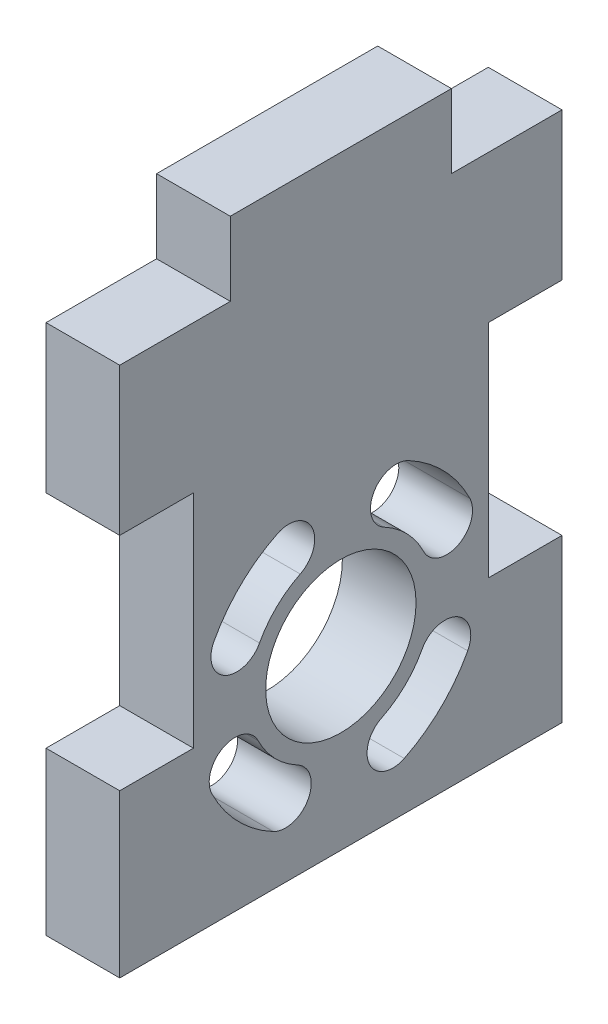
ISO-10303-21;
HEADER;
FILE_DESCRIPTION(('STEP AP214'),'2;1');
FILE_NAME('part.step','',(''),(''),'','','');
FILE_SCHEMA(('AUTOMOTIVE_DESIGN { 1 0 10303 214 1 1 1 1 }'));
ENDSEC;
DATA;
#1=APPLICATION_CONTEXT('core data for automotive mechanical design processes');
#2=APPLICATION_PROTOCOL_DEFINITION('international standard','automotive_design',2000,#1);
#3=PRODUCT_CONTEXT('',#1,'mechanical');
#4=PRODUCT('Part','Part','',(#3));
#5=PRODUCT_RELATED_PRODUCT_CATEGORY('part','',(#4));
#6=PRODUCT_DEFINITION_FORMATION('','',#4);
#7=PRODUCT_DEFINITION_CONTEXT('part definition',#1,'design');
#8=PRODUCT_DEFINITION('design','',#6,#7);
#9=PRODUCT_DEFINITION_SHAPE('','',#8);
#10=(LENGTH_UNIT() NAMED_UNIT(*) SI_UNIT(.MILLI.,.METRE.));
#11=(NAMED_UNIT(*) PLANE_ANGLE_UNIT() SI_UNIT($,.RADIAN.));
#12=(NAMED_UNIT(*) SI_UNIT($,.STERADIAN.) SOLID_ANGLE_UNIT());
#13=UNCERTAINTY_MEASURE_WITH_UNIT(LENGTH_MEASURE(1.E-05),#10,'distance_accuracy_value','');
#14=(GEOMETRIC_REPRESENTATION_CONTEXT(3) GLOBAL_UNCERTAINTY_ASSIGNED_CONTEXT((#13)) GLOBAL_UNIT_ASSIGNED_CONTEXT((#10,
#11,#12)) REPRESENTATION_CONTEXT('',''));
#15=CARTESIAN_POINT('',(0.,0.,0.));
#16=DIRECTION('',(0.,0.,1.));
#17=DIRECTION('',(1.,0.,0.));
#18=AXIS2_PLACEMENT_3D('',#15,#16,#17);
#19=CARTESIAN_POINT('',(5.,0.,0.));
#20=DIRECTION('',(1.,0.,0.));
#21=DIRECTION('',(0.,0.,-1.));
#22=AXIS2_PLACEMENT_3D('',#19,#20,#21);
#23=PLANE('',#22);
#24=DIRECTION('',(0.,1.,0.));
#25=VECTOR('',#24,1.);
#26=CARTESIAN_POINT('',(5.,0.,0.));
#27=LINE('',#26,#25);
#28=CARTESIAN_POINT('',(5.,0.,0.));
#29=VERTEX_POINT('',#28);
#30=CARTESIAN_POINT('',(5.,11.,0.));
#31=VERTEX_POINT('',#30);
#32=EDGE_CURVE('E378',#29,#31,#27,.T.);
#33=ORIENTED_EDGE('',*,*,#32,.T.);
#34=DIRECTION('',(0.,0.,1.));
#35=VECTOR('',#34,1.);
#36=CARTESIAN_POINT('',(5.,11.,0.));
#37=LINE('',#36,#35);
#38=CARTESIAN_POINT('',(5.,11.,5.));
#39=VERTEX_POINT('',#38);
#40=EDGE_CURVE('E381',#31,#39,#37,.T.);
#41=ORIENTED_EDGE('',*,*,#40,.T.);
#42=DIRECTION('',(0.,1.,0.));
#43=VECTOR('',#42,1.);
#44=CARTESIAN_POINT('',(5.,26.,5.));
#45=LINE('',#44,#43);
#46=CARTESIAN_POINT('',(5.,26.,5.));
#47=VERTEX_POINT('',#46);
#48=EDGE_CURVE('E384',#39,#47,#45,.T.);
#49=ORIENTED_EDGE('',*,*,#48,.T.);
#50=DIRECTION('',(0.,0.,-1.));
#51=VECTOR('',#50,1.);
#52=CARTESIAN_POINT('',(5.,26.,0.));
#53=LINE('',#52,#51);
#54=CARTESIAN_POINT('',(5.,26.,0.));
#55=VERTEX_POINT('',#54);
#56=EDGE_CURVE('E386',#47,#55,#53,.T.);
#57=ORIENTED_EDGE('',*,*,#56,.T.);
#58=DIRECTION('',(0.,1.,0.));
#59=VECTOR('',#58,1.);
#60=CARTESIAN_POINT('',(5.,26.,0.));
#61=LINE('',#60,#59);
#62=CARTESIAN_POINT('',(5.,36.,0.));
#63=VERTEX_POINT('',#62);
#64=EDGE_CURVE('E388',#55,#63,#61,.T.);
#65=ORIENTED_EDGE('',*,*,#64,.T.);
#66=DIRECTION('',(0.,0.,1.));
#67=VECTOR('',#66,1.);
#68=CARTESIAN_POINT('',(5.,36.,0.));
#69=LINE('',#68,#67);
#70=CARTESIAN_POINT('',(5.,36.,7.5));
#71=VERTEX_POINT('',#70);
#72=EDGE_CURVE('E390',#63,#71,#69,.T.);
#73=ORIENTED_EDGE('',*,*,#72,.T.);
#74=DIRECTION('',(0.,1.,0.));
#75=VECTOR('',#74,1.);
#76=CARTESIAN_POINT('',(5.,36.,7.5));
#77=LINE('',#76,#75);
#78=CARTESIAN_POINT('',(5.,41.,7.5));
#79=VERTEX_POINT('',#78);
#80=EDGE_CURVE('E392',#71,#79,#77,.T.);
#81=ORIENTED_EDGE('',*,*,#80,.T.);
#82=DIRECTION('',(0.,0.,1.));
#83=VECTOR('',#82,1.);
#84=CARTESIAN_POINT('',(5.,41.,22.5));
#85=LINE('',#84,#83);
#86=CARTESIAN_POINT('',(5.,41.,22.5));
#87=VERTEX_POINT('',#86);
#88=EDGE_CURVE('E394',#79,#87,#85,.T.);
#89=ORIENTED_EDGE('',*,*,#88,.T.);
#90=DIRECTION('',(0.,-1.,0.));
#91=VECTOR('',#90,1.);
#92=CARTESIAN_POINT('',(5.,36.,22.5));
#93=LINE('',#92,#91);
#94=CARTESIAN_POINT('',(5.,36.,22.5));
#95=VERTEX_POINT('',#94);
#96=EDGE_CURVE('E396',#87,#95,#93,.T.);
#97=ORIENTED_EDGE('',*,*,#96,.T.);
#98=DIRECTION('',(0.,0.,1.));
#99=VECTOR('',#98,1.);
#100=CARTESIAN_POINT('',(5.,36.,22.5));
#101=LINE('',#100,#99);
#102=CARTESIAN_POINT('',(5.,36.,30.));
#103=VERTEX_POINT('',#102);
#104=EDGE_CURVE('E398',#95,#103,#101,.T.);
#105=ORIENTED_EDGE('',*,*,#104,.T.);
#106=DIRECTION('',(0.,-1.,0.));
#107=VECTOR('',#106,1.);
#108=CARTESIAN_POINT('',(5.,26.,30.));
#109=LINE('',#108,#107);
#110=CARTESIAN_POINT('',(5.,26.,30.));
#111=VERTEX_POINT('',#110);
#112=EDGE_CURVE('E400',#103,#111,#109,.T.);
#113=ORIENTED_EDGE('',*,*,#112,.T.);
#114=DIRECTION('',(0.,0.,-1.));
#115=VECTOR('',#114,1.);
#116=CARTESIAN_POINT('',(5.,26.,30.));
#117=LINE('',#116,#115);
#118=CARTESIAN_POINT('',(5.,26.,25.));
#119=VERTEX_POINT('',#118);
#120=EDGE_CURVE('E402',#111,#119,#117,.T.);
#121=ORIENTED_EDGE('',*,*,#120,.T.);
#122=DIRECTION('',(0.,-1.,0.));
#123=VECTOR('',#122,1.);
#124=CARTESIAN_POINT('',(5.,26.,25.));
#125=LINE('',#124,#123);
#126=CARTESIAN_POINT('',(5.,11.,25.));
#127=VERTEX_POINT('',#126);
#128=EDGE_CURVE('E404',#119,#127,#125,.T.);
#129=ORIENTED_EDGE('',*,*,#128,.T.);
#130=DIRECTION('',(0.,0.,1.));
#131=VECTOR('',#130,1.);
#132=CARTESIAN_POINT('',(5.,11.,30.));
#133=LINE('',#132,#131);
#134=CARTESIAN_POINT('',(5.,11.,30.));
#135=VERTEX_POINT('',#134);
#136=EDGE_CURVE('E406',#127,#135,#133,.T.);
#137=ORIENTED_EDGE('',*,*,#136,.T.);
#138=DIRECTION('',(0.,-1.,0.));
#139=VECTOR('',#138,1.);
#140=CARTESIAN_POINT('',(5.,0.,30.));
#141=LINE('',#140,#139);
#142=CARTESIAN_POINT('',(5.,0.,30.));
#143=VERTEX_POINT('',#142);
#144=EDGE_CURVE('E408',#135,#143,#141,.T.);
#145=ORIENTED_EDGE('',*,*,#144,.T.);
#146=DIRECTION('',(0.,0.,-1.));
#147=VECTOR('',#146,1.);
#148=CARTESIAN_POINT('',(5.,0.,0.));
#149=LINE('',#148,#147);
#150=EDGE_CURVE('E410',#143,#29,#149,.T.);
#151=ORIENTED_EDGE('',*,*,#150,.T.);
#152=EDGE_LOOP('',(#33,#41,#49,#57,#65,#73,#81,#89,#97,#105,#113,#121,#129,#137,#145,#151));
#153=FACE_BOUND('',#152,.T.);
#154=CARTESIAN_POINT('',(5.,12.,15.));
#155=DIRECTION('',(1.,0.,0.));
#156=DIRECTION('',(0.,0.,-1.));
#157=AXIS2_PLACEMENT_3D('',#154,#155,#156);
#158=CIRCLE('',#157,5.1);
#159=CARTESIAN_POINT('',(5.,12.,9.89999999999999));
#160=VERTEX_POINT('',#159);
#161=EDGE_CURVE('E372',#160,#160,#158,.T.);
#162=ORIENTED_EDGE('',*,*,#161,.F.);
#163=EDGE_LOOP('',(#162));
#164=FACE_BOUND('',#163,.T.);
#165=CARTESIAN_POINT('',(5.,12.,15.));
#166=DIRECTION('',(1.,0.,0.));
#167=DIRECTION('',(0.,0.,-1.));
#168=AXIS2_PLACEMENT_3D('',#165,#166,#167);
#169=CIRCLE('',#168,9.74999999999936);
#170=CARTESIAN_POINT('',(5.,20.7512638042435,19.2985906793419));
#171=VERTEX_POINT('',#170);
#172=CARTESIAN_POINT('',(5.,16.581858510332,23.6063390934407));
#173=VERTEX_POINT('',#172);
#174=EDGE_CURVE('E343',#171,#173,#169,.T.);
#175=ORIENTED_EDGE('',*,*,#174,.F.);
#176=CARTESIAN_POINT('',(5.,19.180524147072,18.5270487625371));
#177=DIRECTION('',(1.,0.,0.));
#178=DIRECTION('',(0.,0.,-1.));
#179=AXIS2_PLACEMENT_3D('',#176,#177,#178);
#180=CIRCLE('',#179,1.74999999999955);
#181=CARTESIAN_POINT('',(5.,17.6097844899002,17.7555068457322));
#182=VERTEX_POINT('',#181);
#183=EDGE_CURVE('E341',#182,#171,#180,.T.);
#184=ORIENTED_EDGE('',*,*,#183,.F.);
#185=CARTESIAN_POINT('',(5.,12.,15.));
#186=DIRECTION('',(-1.,0.,0.));
#187=DIRECTION('',(0.,0.,-1.));
#188=AXIS2_PLACEMENT_3D('',#185,#186,#187);
#189=CIRCLE('',#188,6.25000000000018);
#190=CARTESIAN_POINT('',(5.,14.9370887886746,20.5168840342574));
#191=VERTEX_POINT('',#190);
#192=EDGE_CURVE('E349',#191,#182,#189,.T.);
#193=ORIENTED_EDGE('',*,*,#192,.F.);
#194=CARTESIAN_POINT('',(5.,15.7594736495032,22.0616115638489));
#195=DIRECTION('',(1.,0.,0.));
#196=DIRECTION('',(0.,0.,-1.));
#197=AXIS2_PLACEMENT_3D('',#194,#195,#196);
#198=CIRCLE('',#197,1.74999999999963);
#199=EDGE_CURVE('E346',#173,#191,#198,.T.);
#200=ORIENTED_EDGE('',*,*,#199,.F.);
#201=EDGE_LOOP('',(#175,#184,#193,#200));
#202=FACE_BOUND('',#201,.T.);
#203=CARTESIAN_POINT('',(5.,12.,15.));
#204=DIRECTION('',(1.,0.,0.));
#205=DIRECTION('',(0.,0.,-1.));
#206=AXIS2_PLACEMENT_3D('',#203,#204,#205);
#207=CIRCLE('',#206,9.75000000000021);
#208=CARTESIAN_POINT('',(5.,16.2985906793428,6.24873619575602));
#209=VERTEX_POINT('',#208);
#210=CARTESIAN_POINT('',(5.,20.6063390934415,10.4181414896677));
#211=VERTEX_POINT('',#210);
#212=EDGE_CURVE('E312',#209,#211,#207,.T.);
#213=ORIENTED_EDGE('',*,*,#212,.F.);
#214=CARTESIAN_POINT('',(5.,15.5270487625379,7.81947585292764));
#215=DIRECTION('',(1.,0.,0.));
#216=DIRECTION('',(0.,0.,-1.));
#217=AXIS2_PLACEMENT_3D('',#214,#215,#216);
#218=CIRCLE('',#217,1.74999999999992);
#219=CARTESIAN_POINT('',(5.,14.7555068457327,9.39021551009983));
#220=VERTEX_POINT('',#219);
#221=EDGE_CURVE('E310',#220,#209,#218,.T.);
#222=ORIENTED_EDGE('',*,*,#221,.F.);
#223=CARTESIAN_POINT('',(5.,12.,15.));
#224=DIRECTION('',(-1.,0.,0.));
#225=DIRECTION('',(0.,0.,-1.));
#226=AXIS2_PLACEMENT_3D('',#223,#224,#225);
#227=CIRCLE('',#226,6.25000000000033);
#228=CARTESIAN_POINT('',(5.,17.5168840342575,12.0629112113253));
#229=VERTEX_POINT('',#228);
#230=EDGE_CURVE('E318',#229,#220,#227,.T.);
#231=ORIENTED_EDGE('',*,*,#230,.F.);
#232=CARTESIAN_POINT('',(5.,19.0616115638497,11.2405263504964));
#233=DIRECTION('',(1.,0.,0.));
#234=DIRECTION('',(0.,0.,-1.));
#235=AXIS2_PLACEMENT_3D('',#232,#233,#234);
#236=CIRCLE('',#235,1.74999999999995);
#237=EDGE_CURVE('E315',#211,#229,#236,.T.);
#238=ORIENTED_EDGE('',*,*,#237,.F.);
#239=EDGE_LOOP('',(#213,#222,#231,#238));
#240=FACE_BOUND('',#239,.T.);
#241=CARTESIAN_POINT('',(5.,12.,15.));
#242=DIRECTION('',(1.,0.,0.));
#243=DIRECTION('',(0.,0.,-1.));
#244=AXIS2_PLACEMENT_3D('',#241,#242,#243);
#245=CIRCLE('',#244,9.75000000000019);
#246=CARTESIAN_POINT('',(5.,3.24873619575636,10.7014093206565));
#247=VERTEX_POINT('',#246);
#248=CARTESIAN_POINT('',(5.,7.41814148966858,6.39366090655803));
#249=VERTEX_POINT('',#248);
#250=EDGE_CURVE('E281',#247,#249,#245,.T.);
#251=ORIENTED_EDGE('',*,*,#250,.F.);
#252=CARTESIAN_POINT('',(5.,4.81947585292839,11.4729512374618));
#253=DIRECTION('',(1.,0.,0.));
#254=DIRECTION('',(0.,0.,-1.));
#255=AXIS2_PLACEMENT_3D('',#252,#253,#254);
#256=CIRCLE('',#255,1.75);
#257=CARTESIAN_POINT('',(5.,6.3902155101001,12.2444931542669));
#258=VERTEX_POINT('',#257);
#259=EDGE_CURVE('E279',#258,#247,#256,.T.);
#260=ORIENTED_EDGE('',*,*,#259,.F.);
#261=CARTESIAN_POINT('',(5.,12.,15.));
#262=DIRECTION('',(-1.,0.,0.));
#263=DIRECTION('',(0.,0.,-1.));
#264=AXIS2_PLACEMENT_3D('',#261,#262,#263);
#265=CIRCLE('',#264,6.25000000000027);
#266=CARTESIAN_POINT('',(5.,9.06291121132594,9.4831159657422));
#267=VERTEX_POINT('',#266);
#268=EDGE_CURVE('E287',#267,#258,#265,.T.);
#269=ORIENTED_EDGE('',*,*,#268,.F.);
#270=CARTESIAN_POINT('',(5.,8.24052635049719,7.93838843614999));
#271=DIRECTION('',(1.,0.,0.));
#272=DIRECTION('',(0.,0.,-1.));
#273=AXIS2_PLACEMENT_3D('',#270,#271,#272);
#274=CIRCLE('',#273,1.74999999999993);
#275=EDGE_CURVE('E284',#249,#267,#274,.T.);
#276=ORIENTED_EDGE('',*,*,#275,.F.);
#277=EDGE_LOOP('',(#251,#260,#269,#276));
#278=FACE_BOUND('',#277,.T.);
#279=CARTESIAN_POINT('',(5.,12.,15.));
#280=DIRECTION('',(1.,0.,0.));
#281=DIRECTION('',(0.,0.,-1.));
#282=AXIS2_PLACEMENT_3D('',#279,#280,#281);
#283=CIRCLE('',#282,9.74999999999934);
#284=CARTESIAN_POINT('',(5.,7.70140932065742,23.7512638042431));
#285=VERTEX_POINT('',#284);
#286=CARTESIAN_POINT('',(5.,3.39366090655882,19.5818585103311));
#287=VERTEX_POINT('',#286);
#288=EDGE_CURVE('E251',#285,#287,#283,.T.);
#289=ORIENTED_EDGE('',*,*,#288,.F.);
#290=CARTESIAN_POINT('',(5.,8.47295123746251,22.1805241470713));
#291=DIRECTION('',(1.,0.,0.));
#292=DIRECTION('',(0.,0.,-1.));
#293=AXIS2_PLACEMENT_3D('',#290,#291,#292);
#294=CIRCLE('',#293,1.74999999999963);
#295=CARTESIAN_POINT('',(5.,9.24449315426734,20.6097844898999));
#296=VERTEX_POINT('',#295);
#297=EDGE_CURVE('E243',#296,#285,#294,.T.);
#298=ORIENTED_EDGE('',*,*,#297,.F.);
#299=CARTESIAN_POINT('',(5.,12.,15.));
#300=DIRECTION('',(-1.,0.,0.));
#301=DIRECTION('',(0.,0.,-1.));
#302=AXIS2_PLACEMENT_3D('',#299,#300,#301);
#303=CIRCLE('',#302,6.25000000000011);
#304=CARTESIAN_POINT('',(5.,6.48311596574235,17.937088788674));
#305=VERTEX_POINT('',#304);
#306=EDGE_CURVE('E265',#305,#296,#303,.T.);
#307=ORIENTED_EDGE('',*,*,#306,.F.);
#308=CARTESIAN_POINT('',(5.,4.93838843615074,18.7594736495025));
#309=DIRECTION('',(1.,0.,0.));
#310=DIRECTION('',(0.,0.,-1.));
#311=AXIS2_PLACEMENT_3D('',#308,#309,#310);
#312=CIRCLE('',#311,1.7499999999996);
#313=EDGE_CURVE('E263',#287,#305,#312,.T.);
#314=ORIENTED_EDGE('',*,*,#313,.F.);
#315=EDGE_LOOP('',(#289,#298,#307,#314));
#316=FACE_BOUND('',#315,.T.);
#317=ADVANCED_FACE('F34',(#153,#164,#202,#240,#278,#316),#23,.T.);
#318=CARTESIAN_POINT('',(0.,0.,0.));
#319=DIRECTION('',(1.,0.,0.));
#320=DIRECTION('',(0.,0.,-1.));
#321=AXIS2_PLACEMENT_3D('',#318,#319,#320);
#322=PLANE('',#321);
#323=CARTESIAN_POINT('',(0.,4.81947585292839,11.4729512374618));
#324=DIRECTION('',(1.,0.,0.));
#325=DIRECTION('',(0.,0.,-1.));
#326=AXIS2_PLACEMENT_3D('',#323,#324,#325);
#327=CIRCLE('',#326,1.75);
#328=CARTESIAN_POINT('',(0.,6.3902155101001,12.2444931542669));
#329=VERTEX_POINT('',#328);
#330=CARTESIAN_POINT('',(0.,3.24873619575636,10.7014093206565));
#331=VERTEX_POINT('',#330);
#332=EDGE_CURVE('E259',#329,#331,#327,.T.);
#333=ORIENTED_EDGE('',*,*,#332,.T.);
#334=CARTESIAN_POINT('',(0.,12.,15.));
#335=DIRECTION('',(1.,0.,0.));
#336=DIRECTION('',(0.,0.,-1.));
#337=AXIS2_PLACEMENT_3D('',#334,#335,#336);
#338=CIRCLE('',#337,9.75000000000019);
#339=CARTESIAN_POINT('',(0.,7.41814148966858,6.39366090655803));
#340=VERTEX_POINT('',#339);
#341=EDGE_CURVE('E292',#331,#340,#338,.T.);
#342=ORIENTED_EDGE('',*,*,#341,.T.);
#343=CARTESIAN_POINT('',(0.,8.24052635049719,7.93838843614999));
#344=DIRECTION('',(1.,0.,0.));
#345=DIRECTION('',(0.,0.,-1.));
#346=AXIS2_PLACEMENT_3D('',#343,#344,#345);
#347=CIRCLE('',#346,1.74999999999993);
#348=CARTESIAN_POINT('',(0.,9.06291121132585,9.48311596574204));
#349=VERTEX_POINT('',#348);
#350=EDGE_CURVE('E295',#340,#349,#347,.T.);
#351=ORIENTED_EDGE('',*,*,#350,.T.);
#352=CARTESIAN_POINT('',(0.,12.,15.));
#353=DIRECTION('',(-1.,0.,0.));
#354=DIRECTION('',(0.,0.,-1.));
#355=AXIS2_PLACEMENT_3D('',#352,#353,#354);
#356=CIRCLE('',#355,6.25000000000027);
#357=EDGE_CURVE('E282',#349,#329,#356,.T.);
#358=ORIENTED_EDGE('',*,*,#357,.T.);
#359=EDGE_LOOP('',(#333,#342,#351,#358));
#360=FACE_BOUND('',#359,.T.);
#361=CARTESIAN_POINT('',(0.,19.180524147072,18.5270487625371));
#362=DIRECTION('',(1.,0.,0.));
#363=DIRECTION('',(0.,0.,-1.));
#364=AXIS2_PLACEMENT_3D('',#361,#362,#363);
#365=CIRCLE('',#364,1.74999999999955);
#366=CARTESIAN_POINT('',(0.,17.6097844899002,17.7555068457322));
#367=VERTEX_POINT('',#366);
#368=CARTESIAN_POINT('',(0.,20.7512638042435,19.2985906793419));
#369=VERTEX_POINT('',#368);
#370=EDGE_CURVE('E340',#367,#369,#365,.T.);
#371=ORIENTED_EDGE('',*,*,#370,.T.);
#372=CARTESIAN_POINT('',(0.,12.,15.));
#373=DIRECTION('',(1.,0.,0.));
#374=DIRECTION('',(0.,0.,-1.));
#375=AXIS2_PLACEMENT_3D('',#372,#373,#374);
#376=CIRCLE('',#375,9.74999999999936);
#377=CARTESIAN_POINT('',(0.,16.581858510332,23.6063390934407));
#378=VERTEX_POINT('',#377);
#379=EDGE_CURVE('E354',#369,#378,#376,.T.);
#380=ORIENTED_EDGE('',*,*,#379,.T.);
#381=CARTESIAN_POINT('',(0.,15.7594736495032,22.0616115638489));
#382=DIRECTION('',(1.,0.,0.));
#383=DIRECTION('',(0.,0.,-1.));
#384=AXIS2_PLACEMENT_3D('',#381,#382,#383);
#385=CIRCLE('',#384,1.74999999999963);
#386=CARTESIAN_POINT('',(0.,14.9370887886745,20.5168840342572));
#387=VERTEX_POINT('',#386);
#388=EDGE_CURVE('E357',#378,#387,#385,.T.);
#389=ORIENTED_EDGE('',*,*,#388,.T.);
#390=CARTESIAN_POINT('',(0.,12.,15.));
#391=DIRECTION('',(-1.,0.,0.));
#392=DIRECTION('',(0.,0.,-1.));
#393=AXIS2_PLACEMENT_3D('',#390,#391,#392);
#394=CIRCLE('',#393,6.25000000000018);
#395=EDGE_CURVE('E344',#387,#367,#394,.T.);
#396=ORIENTED_EDGE('',*,*,#395,.T.);
#397=EDGE_LOOP('',(#371,#380,#389,#396));
#398=FACE_BOUND('',#397,.T.);
#399=DIRECTION('',(0.,1.,0.));
#400=VECTOR('',#399,1.);
#401=CARTESIAN_POINT('',(0.,0.,0.));
#402=LINE('',#401,#400);
#403=CARTESIAN_POINT('',(0.,0.,0.));
#404=VERTEX_POINT('',#403);
#405=CARTESIAN_POINT('',(0.,11.,0.));
#406=VERTEX_POINT('',#405);
#407=EDGE_CURVE('E375',#404,#406,#402,.T.);
#408=ORIENTED_EDGE('',*,*,#407,.F.);
#409=DIRECTION('',(0.,0.,-1.));
#410=VECTOR('',#409,1.);
#411=CARTESIAN_POINT('',(0.,0.,0.));
#412=LINE('',#411,#410);
#413=CARTESIAN_POINT('',(0.,0.,30.));
#414=VERTEX_POINT('',#413);
#415=EDGE_CURVE('E382',#414,#404,#412,.T.);
#416=ORIENTED_EDGE('',*,*,#415,.F.);
#417=DIRECTION('',(0.,-1.,0.));
#418=VECTOR('',#417,1.);
#419=CARTESIAN_POINT('',(0.,0.,30.));
#420=LINE('',#419,#418);
#421=CARTESIAN_POINT('',(0.,11.,30.));
#422=VERTEX_POINT('',#421);
#423=EDGE_CURVE('E441',#422,#414,#420,.T.);
#424=ORIENTED_EDGE('',*,*,#423,.F.);
#425=DIRECTION('',(0.,0.,1.));
#426=VECTOR('',#425,1.);
#427=CARTESIAN_POINT('',(0.,11.,30.));
#428=LINE('',#427,#426);
#429=CARTESIAN_POINT('',(0.,11.,25.));
#430=VERTEX_POINT('',#429);
#431=EDGE_CURVE('E439',#430,#422,#428,.T.);
#432=ORIENTED_EDGE('',*,*,#431,.F.);
#433=DIRECTION('',(0.,-1.,0.));
#434=VECTOR('',#433,1.);
#435=CARTESIAN_POINT('',(0.,26.,25.));
#436=LINE('',#435,#434);
#437=CARTESIAN_POINT('',(0.,26.,25.));
#438=VERTEX_POINT('',#437);
#439=EDGE_CURVE('E437',#438,#430,#436,.T.);
#440=ORIENTED_EDGE('',*,*,#439,.F.);
#441=DIRECTION('',(0.,0.,-1.));
#442=VECTOR('',#441,1.);
#443=CARTESIAN_POINT('',(0.,26.,30.));
#444=LINE('',#443,#442);
#445=CARTESIAN_POINT('',(0.,26.,30.));
#446=VERTEX_POINT('',#445);
#447=EDGE_CURVE('E435',#446,#438,#444,.T.);
#448=ORIENTED_EDGE('',*,*,#447,.F.);
#449=DIRECTION('',(0.,-1.,0.));
#450=VECTOR('',#449,1.);
#451=CARTESIAN_POINT('',(0.,26.,30.));
#452=LINE('',#451,#450);
#453=CARTESIAN_POINT('',(0.,36.,30.));
#454=VERTEX_POINT('',#453);
#455=EDGE_CURVE('E433',#454,#446,#452,.T.);
#456=ORIENTED_EDGE('',*,*,#455,.F.);
#457=DIRECTION('',(0.,0.,1.));
#458=VECTOR('',#457,1.);
#459=CARTESIAN_POINT('',(0.,36.,22.5));
#460=LINE('',#459,#458);
#461=CARTESIAN_POINT('',(0.,36.,22.5));
#462=VERTEX_POINT('',#461);
#463=EDGE_CURVE('E431',#462,#454,#460,.T.);
#464=ORIENTED_EDGE('',*,*,#463,.F.);
#465=DIRECTION('',(0.,-1.,0.));
#466=VECTOR('',#465,1.);
#467=CARTESIAN_POINT('',(0.,36.,22.5));
#468=LINE('',#467,#466);
#469=CARTESIAN_POINT('',(0.,41.,22.5));
#470=VERTEX_POINT('',#469);
#471=EDGE_CURVE('E429',#470,#462,#468,.T.);
#472=ORIENTED_EDGE('',*,*,#471,.F.);
#473=DIRECTION('',(0.,0.,1.));
#474=VECTOR('',#473,1.);
#475=CARTESIAN_POINT('',(0.,41.,22.5));
#476=LINE('',#475,#474);
#477=CARTESIAN_POINT('',(0.,41.,7.5));
#478=VERTEX_POINT('',#477);
#479=EDGE_CURVE('E427',#478,#470,#476,.T.);
#480=ORIENTED_EDGE('',*,*,#479,.F.);
#481=DIRECTION('',(0.,1.,0.));
#482=VECTOR('',#481,1.);
#483=CARTESIAN_POINT('',(0.,36.,7.5));
#484=LINE('',#483,#482);
#485=CARTESIAN_POINT('',(0.,36.,7.5));
#486=VERTEX_POINT('',#485);
#487=EDGE_CURVE('E425',#486,#478,#484,.T.);
#488=ORIENTED_EDGE('',*,*,#487,.F.);
#489=DIRECTION('',(0.,0.,1.));
#490=VECTOR('',#489,1.);
#491=CARTESIAN_POINT('',(0.,36.,0.));
#492=LINE('',#491,#490);
#493=CARTESIAN_POINT('',(0.,36.,0.));
#494=VERTEX_POINT('',#493);
#495=EDGE_CURVE('E423',#494,#486,#492,.T.);
#496=ORIENTED_EDGE('',*,*,#495,.F.);
#497=DIRECTION('',(0.,1.,0.));
#498=VECTOR('',#497,1.);
#499=CARTESIAN_POINT('',(0.,26.,0.));
#500=LINE('',#499,#498);
#501=CARTESIAN_POINT('',(0.,26.,0.));
#502=VERTEX_POINT('',#501);
#503=EDGE_CURVE('E421',#502,#494,#500,.T.);
#504=ORIENTED_EDGE('',*,*,#503,.F.);
#505=DIRECTION('',(0.,0.,-1.));
#506=VECTOR('',#505,1.);
#507=CARTESIAN_POINT('',(0.,26.,0.));
#508=LINE('',#507,#506);
#509=CARTESIAN_POINT('',(0.,26.,5.));
#510=VERTEX_POINT('',#509);
#511=EDGE_CURVE('E419',#510,#502,#508,.T.);
#512=ORIENTED_EDGE('',*,*,#511,.F.);
#513=DIRECTION('',(0.,1.,0.));
#514=VECTOR('',#513,1.);
#515=CARTESIAN_POINT('',(0.,26.,5.));
#516=LINE('',#515,#514);
#517=CARTESIAN_POINT('',(0.,11.,5.));
#518=VERTEX_POINT('',#517);
#519=EDGE_CURVE('E417',#518,#510,#516,.T.);
#520=ORIENTED_EDGE('',*,*,#519,.F.);
#521=DIRECTION('',(0.,0.,1.));
#522=VECTOR('',#521,1.);
#523=CARTESIAN_POINT('',(0.,11.,0.));
#524=LINE('',#523,#522);
#525=EDGE_CURVE('E415',#406,#518,#524,.T.);
#526=ORIENTED_EDGE('',*,*,#525,.F.);
#527=EDGE_LOOP('',(#408,#416,#424,#432,#440,#448,#456,#464,#472,#480,#488,#496,#504,#512,#520,#526));
#528=FACE_BOUND('',#527,.T.);
#529=CARTESIAN_POINT('',(0.,12.,15.));
#530=DIRECTION('',(1.,0.,0.));
#531=DIRECTION('',(0.,0.,-1.));
#532=AXIS2_PLACEMENT_3D('',#529,#530,#531);
#533=CIRCLE('',#532,5.1);
#534=CARTESIAN_POINT('',(0.,12.,9.89999999999999));
#535=VERTEX_POINT('',#534);
#536=EDGE_CURVE('E371',#535,#535,#533,.T.);
#537=ORIENTED_EDGE('',*,*,#536,.T.);
#538=EDGE_LOOP('',(#537));
#539=FACE_BOUND('',#538,.T.);
#540=CARTESIAN_POINT('',(0.,15.5270487625379,7.81947585292764));
#541=DIRECTION('',(1.,0.,0.));
#542=DIRECTION('',(0.,0.,-1.));
#543=AXIS2_PLACEMENT_3D('',#540,#541,#542);
#544=CIRCLE('',#543,1.74999999999992);
#545=CARTESIAN_POINT('',(0.,14.7555068457327,9.39021551009983));
#546=VERTEX_POINT('',#545);
#547=CARTESIAN_POINT('',(0.,16.2985906793428,6.24873619575602));
#548=VERTEX_POINT('',#547);
#549=EDGE_CURVE('E309',#546,#548,#544,.T.);
#550=ORIENTED_EDGE('',*,*,#549,.T.);
#551=CARTESIAN_POINT('',(0.,12.,15.));
#552=DIRECTION('',(1.,0.,0.));
#553=DIRECTION('',(0.,0.,-1.));
#554=AXIS2_PLACEMENT_3D('',#551,#552,#553);
#555=CIRCLE('',#554,9.75000000000021);
#556=CARTESIAN_POINT('',(0.,20.6063390934415,10.4181414896677));
#557=VERTEX_POINT('',#556);
#558=EDGE_CURVE('E323',#548,#557,#555,.T.);
#559=ORIENTED_EDGE('',*,*,#558,.T.);
#560=CARTESIAN_POINT('',(0.,19.0616115638497,11.2405263504964));
#561=DIRECTION('',(1.,0.,0.));
#562=DIRECTION('',(0.,0.,-1.));
#563=AXIS2_PLACEMENT_3D('',#560,#561,#562);
#564=CIRCLE('',#563,1.74999999999995);
#565=CARTESIAN_POINT('',(0.,17.5168840342577,12.0629112113253));
#566=VERTEX_POINT('',#565);
#567=EDGE_CURVE('E326',#557,#566,#564,.T.);
#568=ORIENTED_EDGE('',*,*,#567,.T.);
#569=CARTESIAN_POINT('',(0.,12.,15.));
#570=DIRECTION('',(-1.,0.,0.));
#571=DIRECTION('',(0.,0.,-1.));
#572=AXIS2_PLACEMENT_3D('',#569,#570,#571);
#573=CIRCLE('',#572,6.25000000000033);
#574=EDGE_CURVE('E313',#566,#546,#573,.T.);
#575=ORIENTED_EDGE('',*,*,#574,.T.);
#576=EDGE_LOOP('',(#550,#559,#568,#575));
#577=FACE_BOUND('',#576,.T.);
#578=CARTESIAN_POINT('',(0.,8.47295123746251,22.1805241470713));
#579=DIRECTION('',(1.,0.,0.));
#580=DIRECTION('',(0.,0.,-1.));
#581=AXIS2_PLACEMENT_3D('',#578,#579,#580);
#582=CIRCLE('',#581,1.74999999999963);
#583=CARTESIAN_POINT('',(0.,9.24449315426734,20.6097844898999));
#584=VERTEX_POINT('',#583);
#585=CARTESIAN_POINT('',(0.,7.70140932065742,23.7512638042431));
#586=VERTEX_POINT('',#585);
#587=EDGE_CURVE('E57',#584,#586,#582,.T.);
#588=ORIENTED_EDGE('',*,*,#587,.T.);
#589=CARTESIAN_POINT('',(0.,12.,15.));
#590=DIRECTION('',(1.,0.,0.));
#591=DIRECTION('',(0.,0.,-1.));
#592=AXIS2_PLACEMENT_3D('',#589,#590,#591);
#593=CIRCLE('',#592,9.74999999999934);
#594=CARTESIAN_POINT('',(0.,3.39366090655882,19.5818585103311));
#595=VERTEX_POINT('',#594);
#596=EDGE_CURVE('E258',#586,#595,#593,.T.);
#597=ORIENTED_EDGE('',*,*,#596,.T.);
#598=CARTESIAN_POINT('',(0.,4.93838843615074,18.7594736495025));
#599=DIRECTION('',(1.,0.,0.));
#600=DIRECTION('',(0.,0.,-1.));
#601=AXIS2_PLACEMENT_3D('',#598,#599,#600);
#602=CIRCLE('',#601,1.7499999999996);
#603=CARTESIAN_POINT('',(0.,6.4831159657425,17.9370887886739));
#604=VERTEX_POINT('',#603);
#605=EDGE_CURVE('E271',#595,#604,#602,.T.);
#606=ORIENTED_EDGE('',*,*,#605,.T.);
#607=CARTESIAN_POINT('',(0.,12.,15.));
#608=DIRECTION('',(-1.,0.,0.));
#609=DIRECTION('',(0.,0.,-1.));
#610=AXIS2_PLACEMENT_3D('',#607,#608,#609);
#611=CIRCLE('',#610,6.25000000000011);
#612=EDGE_CURVE('E252',#604,#584,#611,.T.);
#613=ORIENTED_EDGE('',*,*,#612,.T.);
#614=EDGE_LOOP('',(#588,#597,#606,#613));
#615=FACE_BOUND('',#614,.T.);
#616=ADVANCED_FACE('F495',(#360,#398,#528,#539,#577,#615),#322,.F.);
#617=CARTESIAN_POINT('',(5.,0.,0.));
#618=DIRECTION('',(0.,0.,1.));
#619=DIRECTION('',(0.,-1.,0.));
#620=AXIS2_PLACEMENT_3D('',#617,#618,#619);
#621=PLANE('',#620);
#622=ORIENTED_EDGE('',*,*,#407,.T.);
#623=DIRECTION('',(-1.,0.,0.));
#624=VECTOR('',#623,1.);
#625=CARTESIAN_POINT('',(5.,11.,0.));
#626=LINE('',#625,#624);
#627=EDGE_CURVE('E11',#31,#406,#626,.T.);
#628=ORIENTED_EDGE('',*,*,#627,.F.);
#629=ORIENTED_EDGE('',*,*,#32,.F.);
#630=DIRECTION('',(-1.,0.,0.));
#631=VECTOR('',#630,1.);
#632=CARTESIAN_POINT('',(5.,0.,0.));
#633=LINE('',#632,#631);
#634=EDGE_CURVE('E412',#29,#404,#633,.T.);
#635=ORIENTED_EDGE('',*,*,#634,.T.);
#636=EDGE_LOOP('',(#622,#628,#629,#635));
#637=FACE_BOUND('',#636,.T.);
#638=ADVANCED_FACE('F36',(#637),#621,.F.);
#639=CARTESIAN_POINT('',(5.,11.,0.));
#640=DIRECTION('',(0.,-1.,0.));
#641=DIRECTION('',(0.,0.,-1.));
#642=AXIS2_PLACEMENT_3D('',#639,#640,#641);
#643=PLANE('',#642);
#644=ORIENTED_EDGE('',*,*,#525,.T.);
#645=DIRECTION('',(-1.,0.,0.));
#646=VECTOR('',#645,1.);
#647=CARTESIAN_POINT('',(5.,11.,5.));
#648=LINE('',#647,#646);
#649=EDGE_CURVE('E42',#39,#518,#648,.T.);
#650=ORIENTED_EDGE('',*,*,#649,.F.);
#651=ORIENTED_EDGE('',*,*,#40,.F.);
#652=ORIENTED_EDGE('',*,*,#627,.T.);
#653=EDGE_LOOP('',(#644,#650,#651,#652));
#654=FACE_BOUND('',#653,.T.);
#655=ADVANCED_FACE('F513',(#654),#643,.F.);
#656=CARTESIAN_POINT('',(5.,26.,5.));
#657=DIRECTION('',(0.,0.,1.));
#658=DIRECTION('',(0.,-1.,0.));
#659=AXIS2_PLACEMENT_3D('',#656,#657,#658);
#660=PLANE('',#659);
#661=ORIENTED_EDGE('',*,*,#519,.T.);
#662=DIRECTION('',(-1.,0.,0.));
#663=VECTOR('',#662,1.);
#664=CARTESIAN_POINT('',(5.,26.,5.));
#665=LINE('',#664,#663);
#666=EDGE_CURVE('E482',#47,#510,#665,.T.);
#667=ORIENTED_EDGE('',*,*,#666,.F.);
#668=ORIENTED_EDGE('',*,*,#48,.F.);
#669=ORIENTED_EDGE('',*,*,#649,.T.);
#670=EDGE_LOOP('',(#661,#667,#668,#669));
#671=FACE_BOUND('',#670,.T.);
#672=ADVANCED_FACE('F489',(#671),#660,.F.);
#673=CARTESIAN_POINT('',(5.,26.,0.));
#674=DIRECTION('',(0.,1.,0.));
#675=DIRECTION('',(0.,0.,1.));
#676=AXIS2_PLACEMENT_3D('',#673,#674,#675);
#677=PLANE('',#676);
#678=ORIENTED_EDGE('',*,*,#511,.T.);
#679=DIRECTION('',(-1.,0.,0.));
#680=VECTOR('',#679,1.);
#681=CARTESIAN_POINT('',(5.,26.,0.));
#682=LINE('',#681,#680);
#683=EDGE_CURVE('E479',#55,#502,#682,.T.);
#684=ORIENTED_EDGE('',*,*,#683,.F.);
#685=ORIENTED_EDGE('',*,*,#56,.F.);
#686=ORIENTED_EDGE('',*,*,#666,.T.);
#687=EDGE_LOOP('',(#678,#684,#685,#686));
#688=FACE_BOUND('',#687,.T.);
#689=ADVANCED_FACE('F501',(#688),#677,.F.);
#690=CARTESIAN_POINT('',(5.,26.,0.));
#691=DIRECTION('',(0.,0.,1.));
#692=DIRECTION('',(0.,-1.,0.));
#693=AXIS2_PLACEMENT_3D('',#690,#691,#692);
#694=PLANE('',#693);
#695=ORIENTED_EDGE('',*,*,#503,.T.);
#696=DIRECTION('',(-1.,0.,0.));
#697=VECTOR('',#696,1.);
#698=CARTESIAN_POINT('',(5.,36.,0.));
#699=LINE('',#698,#697);
#700=EDGE_CURVE('E476',#63,#494,#699,.T.);
#701=ORIENTED_EDGE('',*,*,#700,.F.);
#702=ORIENTED_EDGE('',*,*,#64,.F.);
#703=ORIENTED_EDGE('',*,*,#683,.T.);
#704=EDGE_LOOP('',(#695,#701,#702,#703));
#705=FACE_BOUND('',#704,.T.);
#706=ADVANCED_FACE('F505',(#705),#694,.F.);
#707=CARTESIAN_POINT('',(5.,36.,0.));
#708=DIRECTION('',(0.,-1.,0.));
#709=DIRECTION('',(0.,0.,-1.));
#710=AXIS2_PLACEMENT_3D('',#707,#708,#709);
#711=PLANE('',#710);
#712=ORIENTED_EDGE('',*,*,#495,.T.);
#713=DIRECTION('',(-1.,0.,0.));
#714=VECTOR('',#713,1.);
#715=CARTESIAN_POINT('',(5.,36.,7.5));
#716=LINE('',#715,#714);
#717=EDGE_CURVE('E473',#71,#486,#716,.T.);
#718=ORIENTED_EDGE('',*,*,#717,.F.);
#719=ORIENTED_EDGE('',*,*,#72,.F.);
#720=ORIENTED_EDGE('',*,*,#700,.T.);
#721=EDGE_LOOP('',(#712,#718,#719,#720));
#722=FACE_BOUND('',#721,.T.);
#723=ADVANCED_FACE('F566',(#722),#711,.F.);
#724=CARTESIAN_POINT('',(5.,36.,7.5));
#725=DIRECTION('',(0.,0.,1.));
#726=DIRECTION('',(1.,0.,0.));
#727=AXIS2_PLACEMENT_3D('',#724,#725,#726);
#728=PLANE('',#727);
#729=ORIENTED_EDGE('',*,*,#487,.T.);
#730=DIRECTION('',(-1.,0.,0.));
#731=VECTOR('',#730,1.);
#732=CARTESIAN_POINT('',(5.,41.,7.5));
#733=LINE('',#732,#731);
#734=EDGE_CURVE('E470',#79,#478,#733,.T.);
#735=ORIENTED_EDGE('',*,*,#734,.F.);
#736=ORIENTED_EDGE('',*,*,#80,.F.);
#737=ORIENTED_EDGE('',*,*,#717,.T.);
#738=EDGE_LOOP('',(#729,#735,#736,#737));
#739=FACE_BOUND('',#738,.T.);
#740=ADVANCED_FACE('F563',(#739),#728,.F.);
#741=CARTESIAN_POINT('',(5.,41.,22.5));
#742=DIRECTION('',(0.,-1.,0.));
#743=DIRECTION('',(0.,0.,-1.));
#744=AXIS2_PLACEMENT_3D('',#741,#742,#743);
#745=PLANE('',#744);
#746=ORIENTED_EDGE('',*,*,#479,.T.);
#747=DIRECTION('',(-1.,0.,0.));
#748=VECTOR('',#747,1.);
#749=CARTESIAN_POINT('',(5.,41.,22.5));
#750=LINE('',#749,#748);
#751=EDGE_CURVE('E467',#87,#470,#750,.T.);
#752=ORIENTED_EDGE('',*,*,#751,.F.);
#753=ORIENTED_EDGE('',*,*,#88,.F.);
#754=ORIENTED_EDGE('',*,*,#734,.T.);
#755=EDGE_LOOP('',(#746,#752,#753,#754));
#756=FACE_BOUND('',#755,.T.);
#757=ADVANCED_FACE('F559',(#756),#745,.F.);
#758=CARTESIAN_POINT('',(5.,36.,22.5));
#759=DIRECTION('',(0.,0.,-1.));
#760=DIRECTION('',(-1.,0.,0.));
#761=AXIS2_PLACEMENT_3D('',#758,#759,#760);
#762=PLANE('',#761);
#763=ORIENTED_EDGE('',*,*,#471,.T.);
#764=DIRECTION('',(-1.,0.,0.));
#765=VECTOR('',#764,1.);
#766=CARTESIAN_POINT('',(5.,36.,22.5));
#767=LINE('',#766,#765);
#768=EDGE_CURVE('E464',#95,#462,#767,.T.);
#769=ORIENTED_EDGE('',*,*,#768,.F.);
#770=ORIENTED_EDGE('',*,*,#96,.F.);
#771=ORIENTED_EDGE('',*,*,#751,.T.);
#772=EDGE_LOOP('',(#763,#769,#770,#771));
#773=FACE_BOUND('',#772,.T.);
#774=ADVANCED_FACE('F555',(#773),#762,.F.);
#775=CARTESIAN_POINT('',(5.,36.,22.5));
#776=DIRECTION('',(0.,-1.,0.));
#777=DIRECTION('',(0.,0.,-1.));
#778=AXIS2_PLACEMENT_3D('',#775,#776,#777);
#779=PLANE('',#778);
#780=ORIENTED_EDGE('',*,*,#463,.T.);
#781=DIRECTION('',(-1.,0.,0.));
#782=VECTOR('',#781,1.);
#783=CARTESIAN_POINT('',(5.,36.,30.));
#784=LINE('',#783,#782);
#785=EDGE_CURVE('E461',#103,#454,#784,.T.);
#786=ORIENTED_EDGE('',*,*,#785,.F.);
#787=ORIENTED_EDGE('',*,*,#104,.F.);
#788=ORIENTED_EDGE('',*,*,#768,.T.);
#789=EDGE_LOOP('',(#780,#786,#787,#788));
#790=FACE_BOUND('',#789,.T.);
#791=ADVANCED_FACE('F550',(#790),#779,.F.);
#792=CARTESIAN_POINT('',(5.,26.,30.));
#793=DIRECTION('',(0.,0.,-1.));
#794=DIRECTION('',(-1.,0.,0.));
#795=AXIS2_PLACEMENT_3D('',#792,#793,#794);
#796=PLANE('',#795);
#797=ORIENTED_EDGE('',*,*,#455,.T.);
#798=DIRECTION('',(-1.,0.,0.));
#799=VECTOR('',#798,1.);
#800=CARTESIAN_POINT('',(5.,26.,30.));
#801=LINE('',#800,#799);
#802=EDGE_CURVE('E458',#111,#446,#801,.T.);
#803=ORIENTED_EDGE('',*,*,#802,.F.);
#804=ORIENTED_EDGE('',*,*,#112,.F.);
#805=ORIENTED_EDGE('',*,*,#785,.T.);
#806=EDGE_LOOP('',(#797,#803,#804,#805));
#807=FACE_BOUND('',#806,.T.);
#808=ADVANCED_FACE('F544',(#807),#796,.F.);
#809=CARTESIAN_POINT('',(5.,26.,30.));
#810=DIRECTION('',(0.,1.,0.));
#811=DIRECTION('',(0.,0.,1.));
#812=AXIS2_PLACEMENT_3D('',#809,#810,#811);
#813=PLANE('',#812);
#814=ORIENTED_EDGE('',*,*,#447,.T.);
#815=DIRECTION('',(-1.,0.,0.));
#816=VECTOR('',#815,1.);
#817=CARTESIAN_POINT('',(5.,26.,25.));
#818=LINE('',#817,#816);
#819=EDGE_CURVE('E455',#119,#438,#818,.T.);
#820=ORIENTED_EDGE('',*,*,#819,.F.);
#821=ORIENTED_EDGE('',*,*,#120,.F.);
#822=ORIENTED_EDGE('',*,*,#802,.T.);
#823=EDGE_LOOP('',(#814,#820,#821,#822));
#824=FACE_BOUND('',#823,.T.);
#825=ADVANCED_FACE('F540',(#824),#813,.F.);
#826=CARTESIAN_POINT('',(5.,26.,25.));
#827=DIRECTION('',(0.,0.,-1.));
#828=DIRECTION('',(0.,1.,0.));
#829=AXIS2_PLACEMENT_3D('',#826,#827,#828);
#830=PLANE('',#829);
#831=ORIENTED_EDGE('',*,*,#439,.T.);
#832=DIRECTION('',(-1.,0.,0.));
#833=VECTOR('',#832,1.);
#834=CARTESIAN_POINT('',(5.,11.,25.));
#835=LINE('',#834,#833);
#836=EDGE_CURVE('E452',#127,#430,#835,.T.);
#837=ORIENTED_EDGE('',*,*,#836,.F.);
#838=ORIENTED_EDGE('',*,*,#128,.F.);
#839=ORIENTED_EDGE('',*,*,#819,.T.);
#840=EDGE_LOOP('',(#831,#837,#838,#839));
#841=FACE_BOUND('',#840,.T.);
#842=ADVANCED_FACE('F535',(#841),#830,.F.);
#843=CARTESIAN_POINT('',(5.,11.,30.));
#844=DIRECTION('',(0.,-1.,0.));
#845=DIRECTION('',(0.,0.,-1.));
#846=AXIS2_PLACEMENT_3D('',#843,#844,#845);
#847=PLANE('',#846);
#848=ORIENTED_EDGE('',*,*,#431,.T.);
#849=DIRECTION('',(-1.,0.,0.));
#850=VECTOR('',#849,1.);
#851=CARTESIAN_POINT('',(5.,11.,30.));
#852=LINE('',#851,#850);
#853=EDGE_CURVE('E449',#135,#422,#852,.T.);
#854=ORIENTED_EDGE('',*,*,#853,.F.);
#855=ORIENTED_EDGE('',*,*,#136,.F.);
#856=ORIENTED_EDGE('',*,*,#836,.T.);
#857=EDGE_LOOP('',(#848,#854,#855,#856));
#858=FACE_BOUND('',#857,.T.);
#859=ADVANCED_FACE('F529',(#858),#847,.F.);
#860=CARTESIAN_POINT('',(5.,0.,30.));
#861=DIRECTION('',(0.,0.,-1.));
#862=DIRECTION('',(0.,1.,0.));
#863=AXIS2_PLACEMENT_3D('',#860,#861,#862);
#864=PLANE('',#863);
#865=ORIENTED_EDGE('',*,*,#423,.T.);
#866=DIRECTION('',(-1.,0.,0.));
#867=VECTOR('',#866,1.);
#868=CARTESIAN_POINT('',(5.,0.,30.));
#869=LINE('',#868,#867);
#870=EDGE_CURVE('E446',#143,#414,#869,.T.);
#871=ORIENTED_EDGE('',*,*,#870,.F.);
#872=ORIENTED_EDGE('',*,*,#144,.F.);
#873=ORIENTED_EDGE('',*,*,#853,.T.);
#874=EDGE_LOOP('',(#865,#871,#872,#873));
#875=FACE_BOUND('',#874,.T.);
#876=ADVANCED_FACE('F525',(#875),#864,.F.);
#877=CARTESIAN_POINT('',(5.,0.,0.));
#878=DIRECTION('',(0.,1.,0.));
#879=DIRECTION('',(0.,0.,1.));
#880=AXIS2_PLACEMENT_3D('',#877,#878,#879);
#881=PLANE('',#880);
#882=ORIENTED_EDGE('',*,*,#415,.T.);
#883=ORIENTED_EDGE('',*,*,#634,.F.);
#884=ORIENTED_EDGE('',*,*,#150,.F.);
#885=ORIENTED_EDGE('',*,*,#870,.T.);
#886=EDGE_LOOP('',(#882,#883,#884,#885));
#887=FACE_BOUND('',#886,.T.);
#888=ADVANCED_FACE('F520',(#887),#881,.F.);
#889=CARTESIAN_POINT('',(5.,12.,15.));
#890=DIRECTION('',(-1.,0.,0.));
#891=DIRECTION('',(0.,0.,1.));
#892=AXIS2_PLACEMENT_3D('',#889,#890,#891);
#893=CYLINDRICAL_SURFACE('',#892,5.1);
#894=ORIENTED_EDGE('',*,*,#161,.T.);
#895=EDGE_LOOP('',(#894));
#896=FACE_BOUND('',#895,.T.);
#897=ORIENTED_EDGE('',*,*,#536,.F.);
#898=EDGE_LOOP('',(#897));
#899=FACE_BOUND('',#898,.T.);
#900=ADVANCED_FACE('F583',(#896,#899),#893,.F.);
#901=CARTESIAN_POINT('',(5.,19.180524147072,18.5270487625371));
#902=DIRECTION('',(-1.,0.,0.));
#903=DIRECTION('',(0.,0.,1.));
#904=AXIS2_PLACEMENT_3D('',#901,#902,#903);
#905=CYLINDRICAL_SURFACE('',#904,1.74999999999955);
#906=ORIENTED_EDGE('',*,*,#370,.F.);
#907=DIRECTION('',(-1.,0.,0.));
#908=VECTOR('',#907,1.);
#909=CARTESIAN_POINT('',(5.,17.6097844899002,17.7555068457322));
#910=LINE('',#909,#908);
#911=EDGE_CURVE('E351',#182,#367,#910,.T.);
#912=ORIENTED_EDGE('',*,*,#911,.F.);
#913=ORIENTED_EDGE('',*,*,#183,.T.);
#914=DIRECTION('',(-1.,0.,0.));
#915=VECTOR('',#914,1.);
#916=CARTESIAN_POINT('',(5.,20.7512638042435,19.2985906793419));
#917=LINE('',#916,#915);
#918=EDGE_CURVE('E368',#171,#369,#917,.T.);
#919=ORIENTED_EDGE('',*,*,#918,.T.);
#920=EDGE_LOOP('',(#906,#912,#913,#919));
#921=FACE_BOUND('',#920,.T.);
#922=ADVANCED_FACE('F645',(#921),#905,.F.);
#923=CARTESIAN_POINT('',(5.,12.,15.));
#924=DIRECTION('',(-1.,0.,0.));
#925=DIRECTION('',(0.,0.,1.));
#926=AXIS2_PLACEMENT_3D('',#923,#924,#925);
#927=CYLINDRICAL_SURFACE('',#926,9.74999999999936);
#928=ORIENTED_EDGE('',*,*,#379,.F.);
#929=ORIENTED_EDGE('',*,*,#918,.F.);
#930=ORIENTED_EDGE('',*,*,#174,.T.);
#931=DIRECTION('',(-1.,0.,0.));
#932=VECTOR('',#931,1.);
#933=CARTESIAN_POINT('',(5.,16.581858510332,23.6063390934407));
#934=LINE('',#933,#932);
#935=EDGE_CURVE('E366',#173,#378,#934,.T.);
#936=ORIENTED_EDGE('',*,*,#935,.T.);
#937=EDGE_LOOP('',(#928,#929,#930,#936));
#938=FACE_BOUND('',#937,.T.);
#939=ADVANCED_FACE('F652',(#938),#927,.F.);
#940=CARTESIAN_POINT('',(5.,15.7594736495032,22.0616115638489));
#941=DIRECTION('',(-1.,0.,0.));
#942=DIRECTION('',(0.,0.,1.));
#943=AXIS2_PLACEMENT_3D('',#940,#941,#942);
#944=CYLINDRICAL_SURFACE('',#943,1.74999999999963);
#945=ORIENTED_EDGE('',*,*,#388,.F.);
#946=ORIENTED_EDGE('',*,*,#935,.F.);
#947=ORIENTED_EDGE('',*,*,#199,.T.);
#948=DIRECTION('',(-1.,0.,0.));
#949=VECTOR('',#948,1.);
#950=CARTESIAN_POINT('',(5.,14.9370887886745,20.5168840342572));
#951=LINE('',#950,#949);
#952=EDGE_CURVE('E364',#191,#387,#951,.T.);
#953=ORIENTED_EDGE('',*,*,#952,.T.);
#954=EDGE_LOOP('',(#945,#946,#947,#953));
#955=FACE_BOUND('',#954,.T.);
#956=ADVANCED_FACE('F659',(#955),#944,.F.);
#957=CARTESIAN_POINT('',(5.,12.,15.));
#958=DIRECTION('',(-1.,0.,0.));
#959=DIRECTION('',(0.,0.,1.));
#960=AXIS2_PLACEMENT_3D('',#957,#958,#959);
#961=CYLINDRICAL_SURFACE('',#960,6.25000000000018);
#962=ORIENTED_EDGE('',*,*,#395,.F.);
#963=ORIENTED_EDGE('',*,*,#952,.F.);
#964=ORIENTED_EDGE('',*,*,#192,.T.);
#965=ORIENTED_EDGE('',*,*,#911,.T.);
#966=EDGE_LOOP('',(#962,#963,#964,#965));
#967=FACE_BOUND('',#966,.T.);
#968=ADVANCED_FACE('F667',(#967),#961,.T.);
#969=CARTESIAN_POINT('',(5.,15.5270487625379,7.81947585292764));
#970=DIRECTION('',(-1.,0.,0.));
#971=DIRECTION('',(0.,0.,1.));
#972=AXIS2_PLACEMENT_3D('',#969,#970,#971);
#973=CYLINDRICAL_SURFACE('',#972,1.74999999999992);
#974=ORIENTED_EDGE('',*,*,#549,.F.);
#975=DIRECTION('',(-1.,0.,0.));
#976=VECTOR('',#975,1.);
#977=CARTESIAN_POINT('',(5.,14.7555068457327,9.39021551009983));
#978=LINE('',#977,#976);
#979=EDGE_CURVE('E320',#220,#546,#978,.T.);
#980=ORIENTED_EDGE('',*,*,#979,.F.);
#981=ORIENTED_EDGE('',*,*,#221,.T.);
#982=DIRECTION('',(-1.,0.,0.));
#983=VECTOR('',#982,1.);
#984=CARTESIAN_POINT('',(5.,16.2985906793428,6.24873619575602));
#985=LINE('',#984,#983);
#986=EDGE_CURVE('E337',#209,#548,#985,.T.);
#987=ORIENTED_EDGE('',*,*,#986,.T.);
#988=EDGE_LOOP('',(#974,#980,#981,#987));
#989=FACE_BOUND('',#988,.T.);
#990=ADVANCED_FACE('F675',(#989),#973,.F.);
#991=CARTESIAN_POINT('',(5.,12.,15.));
#992=DIRECTION('',(-1.,0.,0.));
#993=DIRECTION('',(0.,0.,1.));
#994=AXIS2_PLACEMENT_3D('',#991,#992,#993);
#995=CYLINDRICAL_SURFACE('',#994,9.75000000000021);
#996=ORIENTED_EDGE('',*,*,#558,.F.);
#997=ORIENTED_EDGE('',*,*,#986,.F.);
#998=ORIENTED_EDGE('',*,*,#212,.T.);
#999=DIRECTION('',(-1.,0.,0.));
#1000=VECTOR('',#999,1.);
#1001=CARTESIAN_POINT('',(5.,20.6063390934415,10.4181414896677));
#1002=LINE('',#1001,#1000);
#1003=EDGE_CURVE('E335',#211,#557,#1002,.T.);
#1004=ORIENTED_EDGE('',*,*,#1003,.T.);
#1005=EDGE_LOOP('',(#996,#997,#998,#1004));
#1006=FACE_BOUND('',#1005,.T.);
#1007=ADVANCED_FACE('F683',(#1006),#995,.F.);
#1008=CARTESIAN_POINT('',(5.,19.0616115638497,11.2405263504964));
#1009=DIRECTION('',(-1.,0.,0.));
#1010=DIRECTION('',(0.,0.,1.));
#1011=AXIS2_PLACEMENT_3D('',#1008,#1009,#1010);
#1012=CYLINDRICAL_SURFACE('',#1011,1.74999999999995);
#1013=ORIENTED_EDGE('',*,*,#567,.F.);
#1014=ORIENTED_EDGE('',*,*,#1003,.F.);
#1015=ORIENTED_EDGE('',*,*,#237,.T.);
#1016=DIRECTION('',(-1.,0.,0.));
#1017=VECTOR('',#1016,1.);
#1018=CARTESIAN_POINT('',(5.,17.5168840342577,12.0629112113253));
#1019=LINE('',#1018,#1017);
#1020=EDGE_CURVE('E333',#229,#566,#1019,.T.);
#1021=ORIENTED_EDGE('',*,*,#1020,.T.);
#1022=EDGE_LOOP('',(#1013,#1014,#1015,#1021));
#1023=FACE_BOUND('',#1022,.T.);
#1024=ADVANCED_FACE('F691',(#1023),#1012,.F.);
#1025=CARTESIAN_POINT('',(5.,12.,15.));
#1026=DIRECTION('',(-1.,0.,0.));
#1027=DIRECTION('',(0.,0.,1.));
#1028=AXIS2_PLACEMENT_3D('',#1025,#1026,#1027);
#1029=CYLINDRICAL_SURFACE('',#1028,6.25000000000033);
#1030=ORIENTED_EDGE('',*,*,#574,.F.);
#1031=ORIENTED_EDGE('',*,*,#1020,.F.);
#1032=ORIENTED_EDGE('',*,*,#230,.T.);
#1033=ORIENTED_EDGE('',*,*,#979,.T.);
#1034=EDGE_LOOP('',(#1030,#1031,#1032,#1033));
#1035=FACE_BOUND('',#1034,.T.);
#1036=ADVANCED_FACE('F699',(#1035),#1029,.T.);
#1037=CARTESIAN_POINT('',(5.,4.81947585292839,11.4729512374618));
#1038=DIRECTION('',(-1.,0.,0.));
#1039=DIRECTION('',(0.,0.,1.));
#1040=AXIS2_PLACEMENT_3D('',#1037,#1038,#1039);
#1041=CYLINDRICAL_SURFACE('',#1040,1.75);
#1042=ORIENTED_EDGE('',*,*,#332,.F.);
#1043=DIRECTION('',(-1.,0.,0.));
#1044=VECTOR('',#1043,1.);
#1045=CARTESIAN_POINT('',(5.,6.3902155101001,12.2444931542669));
#1046=LINE('',#1045,#1044);
#1047=EDGE_CURVE('E289',#258,#329,#1046,.T.);
#1048=ORIENTED_EDGE('',*,*,#1047,.F.);
#1049=ORIENTED_EDGE('',*,*,#259,.T.);
#1050=DIRECTION('',(-1.,0.,0.));
#1051=VECTOR('',#1050,1.);
#1052=CARTESIAN_POINT('',(5.,3.24873619575636,10.7014093206565));
#1053=LINE('',#1052,#1051);
#1054=EDGE_CURVE('E306',#247,#331,#1053,.T.);
#1055=ORIENTED_EDGE('',*,*,#1054,.T.);
#1056=EDGE_LOOP('',(#1042,#1048,#1049,#1055));
#1057=FACE_BOUND('',#1056,.T.);
#1058=ADVANCED_FACE('F707',(#1057),#1041,.F.);
#1059=CARTESIAN_POINT('',(5.,12.,15.));
#1060=DIRECTION('',(-1.,0.,0.));
#1061=DIRECTION('',(0.,0.,1.));
#1062=AXIS2_PLACEMENT_3D('',#1059,#1060,#1061);
#1063=CYLINDRICAL_SURFACE('',#1062,9.75000000000019);
#1064=ORIENTED_EDGE('',*,*,#341,.F.);
#1065=ORIENTED_EDGE('',*,*,#1054,.F.);
#1066=ORIENTED_EDGE('',*,*,#250,.T.);
#1067=DIRECTION('',(-1.,0.,0.));
#1068=VECTOR('',#1067,1.);
#1069=CARTESIAN_POINT('',(5.,7.41814148966858,6.39366090655803));
#1070=LINE('',#1069,#1068);
#1071=EDGE_CURVE('E304',#249,#340,#1070,.T.);
#1072=ORIENTED_EDGE('',*,*,#1071,.T.);
#1073=EDGE_LOOP('',(#1064,#1065,#1066,#1072));
#1074=FACE_BOUND('',#1073,.T.);
#1075=ADVANCED_FACE('F715',(#1074),#1063,.F.);
#1076=CARTESIAN_POINT('',(5.,8.24052635049719,7.93838843614999));
#1077=DIRECTION('',(-1.,0.,0.));
#1078=DIRECTION('',(0.,0.,1.));
#1079=AXIS2_PLACEMENT_3D('',#1076,#1077,#1078);
#1080=CYLINDRICAL_SURFACE('',#1079,1.74999999999993);
#1081=ORIENTED_EDGE('',*,*,#350,.F.);
#1082=ORIENTED_EDGE('',*,*,#1071,.F.);
#1083=ORIENTED_EDGE('',*,*,#275,.T.);
#1084=DIRECTION('',(-1.,0.,0.));
#1085=VECTOR('',#1084,1.);
#1086=CARTESIAN_POINT('',(5.,9.06291121132585,9.48311596574204));
#1087=LINE('',#1086,#1085);
#1088=EDGE_CURVE('E302',#267,#349,#1087,.T.);
#1089=ORIENTED_EDGE('',*,*,#1088,.T.);
#1090=EDGE_LOOP('',(#1081,#1082,#1083,#1089));
#1091=FACE_BOUND('',#1090,.T.);
#1092=ADVANCED_FACE('F723',(#1091),#1080,.F.);
#1093=CARTESIAN_POINT('',(5.,12.,15.));
#1094=DIRECTION('',(-1.,0.,0.));
#1095=DIRECTION('',(0.,0.,1.));
#1096=AXIS2_PLACEMENT_3D('',#1093,#1094,#1095);
#1097=CYLINDRICAL_SURFACE('',#1096,6.25000000000027);
#1098=ORIENTED_EDGE('',*,*,#357,.F.);
#1099=ORIENTED_EDGE('',*,*,#1088,.F.);
#1100=ORIENTED_EDGE('',*,*,#268,.T.);
#1101=ORIENTED_EDGE('',*,*,#1047,.T.);
#1102=EDGE_LOOP('',(#1098,#1099,#1100,#1101));
#1103=FACE_BOUND('',#1102,.T.);
#1104=ADVANCED_FACE('F731',(#1103),#1097,.T.);
#1105=CARTESIAN_POINT('',(5.,8.47295123746251,22.1805241470713));
#1106=DIRECTION('',(-1.,0.,0.));
#1107=DIRECTION('',(0.,0.,1.));
#1108=AXIS2_PLACEMENT_3D('',#1105,#1106,#1107);
#1109=CYLINDRICAL_SURFACE('',#1108,1.74999999999963);
#1110=ORIENTED_EDGE('',*,*,#587,.F.);
#1111=DIRECTION('',(-1.,0.,0.));
#1112=VECTOR('',#1111,1.);
#1113=CARTESIAN_POINT('',(5.,9.24449315426734,20.6097844898999));
#1114=LINE('',#1113,#1112);
#1115=EDGE_CURVE('E247',#296,#584,#1114,.T.);
#1116=ORIENTED_EDGE('',*,*,#1115,.F.);
#1117=ORIENTED_EDGE('',*,*,#297,.T.);
#1118=DIRECTION('',(-1.,0.,0.));
#1119=VECTOR('',#1118,1.);
#1120=CARTESIAN_POINT('',(5.,7.70140932065742,23.7512638042431));
#1121=LINE('',#1120,#1119);
#1122=EDGE_CURVE('E246',#285,#586,#1121,.T.);
#1123=ORIENTED_EDGE('',*,*,#1122,.T.);
#1124=EDGE_LOOP('',(#1110,#1116,#1117,#1123));
#1125=FACE_BOUND('',#1124,.T.);
#1126=ADVANCED_FACE('F245',(#1125),#1109,.F.);
#1127=CARTESIAN_POINT('',(5.,12.,15.));
#1128=DIRECTION('',(-1.,0.,0.));
#1129=DIRECTION('',(0.,0.,1.));
#1130=AXIS2_PLACEMENT_3D('',#1127,#1128,#1129);
#1131=CYLINDRICAL_SURFACE('',#1130,9.74999999999934);
#1132=ORIENTED_EDGE('',*,*,#596,.F.);
#1133=ORIENTED_EDGE('',*,*,#1122,.F.);
#1134=ORIENTED_EDGE('',*,*,#288,.T.);
#1135=DIRECTION('',(-1.,0.,0.));
#1136=VECTOR('',#1135,1.);
#1137=CARTESIAN_POINT('',(5.,3.39366090655882,19.5818585103311));
#1138=LINE('',#1137,#1136);
#1139=EDGE_CURVE('E260',#287,#595,#1138,.T.);
#1140=ORIENTED_EDGE('',*,*,#1139,.T.);
#1141=EDGE_LOOP('',(#1132,#1133,#1134,#1140));
#1142=FACE_BOUND('',#1141,.T.);
#1143=ADVANCED_FACE('F255',(#1142),#1131,.F.);
#1144=CARTESIAN_POINT('',(5.,4.93838843615074,18.7594736495025));
#1145=DIRECTION('',(-1.,0.,0.));
#1146=DIRECTION('',(0.,0.,1.));
#1147=AXIS2_PLACEMENT_3D('',#1144,#1145,#1146);
#1148=CYLINDRICAL_SURFACE('',#1147,1.7499999999996);
#1149=ORIENTED_EDGE('',*,*,#605,.F.);
#1150=ORIENTED_EDGE('',*,*,#1139,.F.);
#1151=ORIENTED_EDGE('',*,*,#313,.T.);
#1152=DIRECTION('',(-1.,0.,0.));
#1153=VECTOR('',#1152,1.);
#1154=CARTESIAN_POINT('',(5.,6.4831159657425,17.9370887886739));
#1155=LINE('',#1154,#1153);
#1156=EDGE_CURVE('E49',#305,#604,#1155,.T.);
#1157=ORIENTED_EDGE('',*,*,#1156,.T.);
#1158=EDGE_LOOP('',(#1149,#1150,#1151,#1157));
#1159=FACE_BOUND('',#1158,.T.);
#1160=ADVANCED_FACE('F752',(#1159),#1148,.F.);
#1161=CARTESIAN_POINT('',(5.,12.,15.));
#1162=DIRECTION('',(-1.,0.,0.));
#1163=DIRECTION('',(0.,0.,1.));
#1164=AXIS2_PLACEMENT_3D('',#1161,#1162,#1163);
#1165=CYLINDRICAL_SURFACE('',#1164,6.25000000000011);
#1166=ORIENTED_EDGE('',*,*,#612,.F.);
#1167=ORIENTED_EDGE('',*,*,#1156,.F.);
#1168=ORIENTED_EDGE('',*,*,#306,.T.);
#1169=ORIENTED_EDGE('',*,*,#1115,.T.);
#1170=EDGE_LOOP('',(#1166,#1167,#1168,#1169));
#1171=FACE_BOUND('',#1170,.T.);
#1172=ADVANCED_FACE('F759',(#1171),#1165,.T.);
#1173=CLOSED_SHELL('',(#317,#616,#638,#655,#672,#689,#706,#723,#740,#757,#774,#791,#808,#825,
#842,#859,#876,#888,#900,#922,#939,#956,#968,#990,#1007,#1024,#1036,#1058,#1075,#1092,#1104,
#1126,#1143,#1160,#1172));
#1174=MANIFOLD_SOLID_BREP('B2',#1173);
#1175=ADVANCED_BREP_SHAPE_REPRESENTATION('',(#18,#1174),#14);
#1176=SHAPE_DEFINITION_REPRESENTATION(#9,#1175);
ENDSEC;
END-ISO-10303-21;
